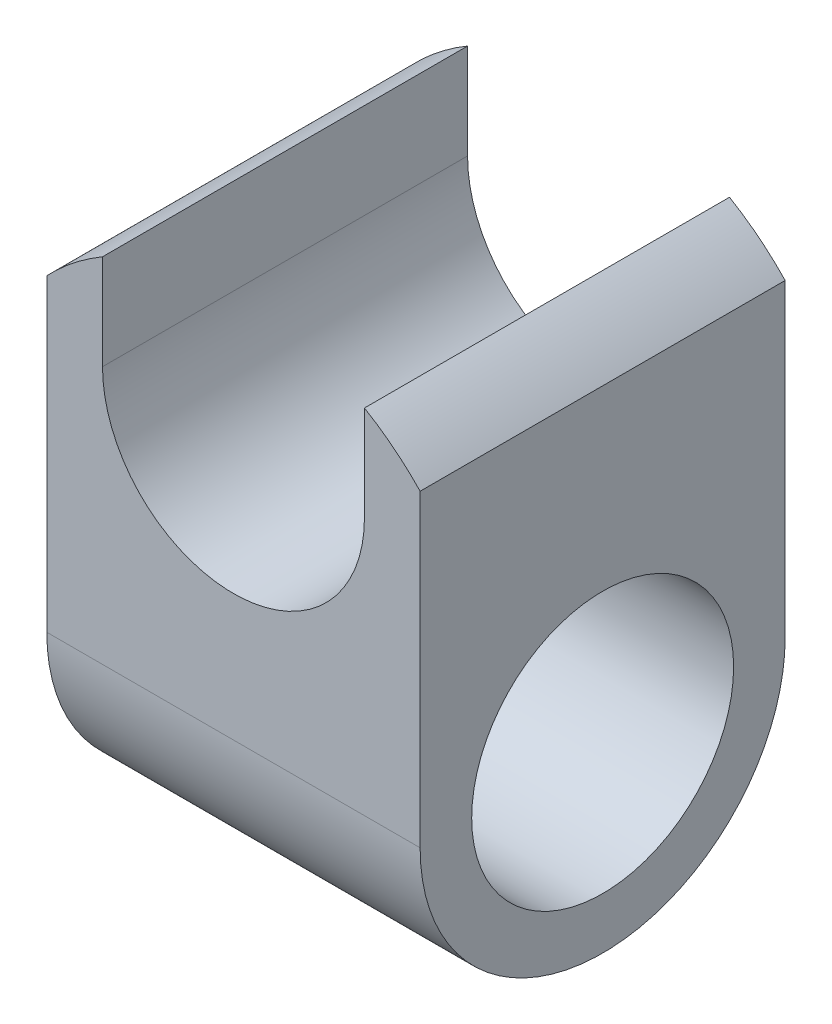
ISO-10303-21;
HEADER;
FILE_DESCRIPTION(('STEP AP214'),'2;1');
FILE_NAME('part.step','',(''),(''),'','','');
FILE_SCHEMA(('AUTOMOTIVE_DESIGN { 1 0 10303 214 1 1 1 1 }'));
ENDSEC;
DATA;
#1=APPLICATION_CONTEXT('core data for automotive mechanical design processes');
#2=APPLICATION_PROTOCOL_DEFINITION('international standard','automotive_design',2000,#1);
#3=PRODUCT_CONTEXT('',#1,'mechanical');
#4=PRODUCT('Part','Part','',(#3));
#5=PRODUCT_RELATED_PRODUCT_CATEGORY('part','',(#4));
#6=PRODUCT_DEFINITION_FORMATION('','',#4);
#7=PRODUCT_DEFINITION_CONTEXT('part definition',#1,'design');
#8=PRODUCT_DEFINITION('design','',#6,#7);
#9=PRODUCT_DEFINITION_SHAPE('','',#8);
#10=(LENGTH_UNIT() NAMED_UNIT(*) SI_UNIT(.MILLI.,.METRE.));
#11=(NAMED_UNIT(*) PLANE_ANGLE_UNIT() SI_UNIT($,.RADIAN.));
#12=(NAMED_UNIT(*) SI_UNIT($,.STERADIAN.) SOLID_ANGLE_UNIT());
#13=UNCERTAINTY_MEASURE_WITH_UNIT(LENGTH_MEASURE(1.E-05),#10,'distance_accuracy_value','');
#14=(GEOMETRIC_REPRESENTATION_CONTEXT(3) GLOBAL_UNCERTAINTY_ASSIGNED_CONTEXT((#13)) GLOBAL_UNIT_ASSIGNED_CONTEXT((#10,
#11,#12)) REPRESENTATION_CONTEXT('',''));
#15=CARTESIAN_POINT('',(0.,0.,0.));
#16=DIRECTION('',(0.,0.,1.));
#17=DIRECTION('',(1.,0.,0.));
#18=AXIS2_PLACEMENT_3D('',#15,#16,#17);
#19=CARTESIAN_POINT('',(0.,-18.65,8.85));
#20=DIRECTION('',(0.,0.,1.));
#21=DIRECTION('',(1.,0.,0.));
#22=AXIS2_PLACEMENT_3D('',#19,#20,#21);
#23=PLANE('',#22);
#24=CARTESIAN_POINT('',(0.,-6.15,8.85));
#25=DIRECTION('',(0.,0.,1.));
#26=DIRECTION('',(1.,0.,0.));
#27=AXIS2_PLACEMENT_3D('',#24,#25,#26);
#28=CIRCLE('',#27,12.5);
#29=CARTESIAN_POINT('',(-9.04999999999999,2.47249963757611,8.85));
#30=VERTEX_POINT('',#29);
#31=CARTESIAN_POINT('',(-6.35,4.61696336020514,8.85));
#32=VERTEX_POINT('',#31);
#33=EDGE_CURVE('E166',#30,#32,#28,.F.);
#34=ORIENTED_EDGE('',*,*,#33,.F.);
#35=DIRECTION('',(0.,-1.,0.));
#36=VECTOR('',#35,1.);
#37=CARTESIAN_POINT('',(-9.05,0.,8.85));
#38=LINE('',#37,#36);
#39=CARTESIAN_POINT('',(-9.05,-12.5,8.85));
#40=VERTEX_POINT('',#39);
#41=EDGE_CURVE('E163',#30,#40,#38,.T.);
#42=ORIENTED_EDGE('',*,*,#41,.T.);
#43=DIRECTION('',(-1.,0.,0.));
#44=VECTOR('',#43,1.);
#45=CARTESIAN_POINT('',(9.05,-12.5,8.85));
#46=LINE('',#45,#44);
#47=CARTESIAN_POINT('',(9.05,-12.5,8.85));
#48=VERTEX_POINT('',#47);
#49=EDGE_CURVE('E181',#48,#40,#46,.T.);
#50=ORIENTED_EDGE('',*,*,#49,.F.);
#51=DIRECTION('',(0.,1.,0.));
#52=VECTOR('',#51,1.);
#53=CARTESIAN_POINT('',(9.05,0.,8.85));
#54=LINE('',#53,#52);
#55=CARTESIAN_POINT('',(9.04999999999999,2.47249963757611,8.85));
#56=VERTEX_POINT('',#55);
#57=EDGE_CURVE('E188',#48,#56,#54,.T.);
#58=ORIENTED_EDGE('',*,*,#57,.T.);
#59=CARTESIAN_POINT('',(6.35,4.61696336020514,8.85));
#60=VERTEX_POINT('',#59);
#61=EDGE_CURVE('E164',#60,#56,#28,.F.);
#62=ORIENTED_EDGE('',*,*,#61,.F.);
#63=DIRECTION('',(0.,-1.,0.));
#64=VECTOR('',#63,1.);
#65=CARTESIAN_POINT('',(6.35,0.,8.85));
#66=LINE('',#65,#64);
#67=CARTESIAN_POINT('',(6.35,0.,8.85));
#68=VERTEX_POINT('',#67);
#69=EDGE_CURVE('E113',#60,#68,#66,.T.);
#70=ORIENTED_EDGE('',*,*,#69,.T.);
#71=CARTESIAN_POINT('',(0.,0.,8.85));
#72=DIRECTION('',(0.,0.,-1.));
#73=DIRECTION('',(1.,0.,0.));
#74=AXIS2_PLACEMENT_3D('',#71,#72,#73);
#75=CIRCLE('',#74,6.35);
#76=CARTESIAN_POINT('',(-6.35,0.,8.85));
#77=VERTEX_POINT('',#76);
#78=EDGE_CURVE('E120',#68,#77,#75,.T.);
#79=ORIENTED_EDGE('',*,*,#78,.T.);
#80=DIRECTION('',(0.,1.,0.));
#81=VECTOR('',#80,1.);
#82=CARTESIAN_POINT('',(-6.35,0.,8.85));
#83=LINE('',#82,#81);
#84=EDGE_CURVE('E123',#77,#32,#83,.T.);
#85=ORIENTED_EDGE('',*,*,#84,.T.);
#86=EDGE_LOOP('',(#34,#42,#50,#58,#62,#70,#79,#85));
#87=FACE_BOUND('',#86,.T.);
#88=ADVANCED_FACE('F32',(#87),#23,.T.);
#89=CARTESIAN_POINT('',(0.,-18.65,-8.85));
#90=DIRECTION('',(0.,0.,1.));
#91=DIRECTION('',(1.,0.,0.));
#92=AXIS2_PLACEMENT_3D('',#89,#90,#91);
#93=PLANE('',#92);
#94=DIRECTION('',(0.,-1.,0.));
#95=VECTOR('',#94,1.);
#96=CARTESIAN_POINT('',(-9.05,0.,-8.85));
#97=LINE('',#96,#95);
#98=CARTESIAN_POINT('',(-9.04999999999999,2.47249963757611,-8.85));
#99=VERTEX_POINT('',#98);
#100=CARTESIAN_POINT('',(-9.05,-12.5,-8.85));
#101=VERTEX_POINT('',#100);
#102=EDGE_CURVE('E125',#99,#101,#97,.T.);
#103=ORIENTED_EDGE('',*,*,#102,.F.);
#104=CARTESIAN_POINT('',(0.,-6.15,-8.85));
#105=DIRECTION('',(0.,0.,1.));
#106=DIRECTION('',(1.,0.,0.));
#107=AXIS2_PLACEMENT_3D('',#104,#105,#106);
#108=CIRCLE('',#107,12.5);
#109=CARTESIAN_POINT('',(-6.34999999999999,4.61696336020514,-8.85));
#110=VERTEX_POINT('',#109);
#111=EDGE_CURVE('E11',#99,#110,#108,.F.);
#112=ORIENTED_EDGE('',*,*,#111,.T.);
#113=DIRECTION('',(0.,1.,0.));
#114=VECTOR('',#113,1.);
#115=CARTESIAN_POINT('',(-6.35,0.,-8.85));
#116=LINE('',#115,#114);
#117=CARTESIAN_POINT('',(-6.35,0.,-8.85));
#118=VERTEX_POINT('',#117);
#119=EDGE_CURVE('E140',#118,#110,#116,.T.);
#120=ORIENTED_EDGE('',*,*,#119,.F.);
#121=CARTESIAN_POINT('',(0.,0.,-8.85));
#122=DIRECTION('',(0.,0.,-1.));
#123=DIRECTION('',(1.,0.,0.));
#124=AXIS2_PLACEMENT_3D('',#121,#122,#123);
#125=CIRCLE('',#124,6.35);
#126=CARTESIAN_POINT('',(6.35,0.,-8.85));
#127=VERTEX_POINT('',#126);
#128=EDGE_CURVE('E119',#127,#118,#125,.T.);
#129=ORIENTED_EDGE('',*,*,#128,.F.);
#130=DIRECTION('',(0.,-1.,0.));
#131=VECTOR('',#130,1.);
#132=CARTESIAN_POINT('',(6.35,0.,-8.85));
#133=LINE('',#132,#131);
#134=CARTESIAN_POINT('',(6.34999999999999,4.61696336020514,-8.85));
#135=VERTEX_POINT('',#134);
#136=EDGE_CURVE('E111',#135,#127,#133,.T.);
#137=ORIENTED_EDGE('',*,*,#136,.F.);
#138=CARTESIAN_POINT('',(9.04999999999999,2.47249963757611,-8.85));
#139=VERTEX_POINT('',#138);
#140=EDGE_CURVE('E46',#135,#139,#108,.F.);
#141=ORIENTED_EDGE('',*,*,#140,.T.);
#142=DIRECTION('',(0.,1.,0.));
#143=VECTOR('',#142,1.);
#144=CARTESIAN_POINT('',(9.05,0.,-8.85));
#145=LINE('',#144,#143);
#146=CARTESIAN_POINT('',(9.05,-12.5,-8.85));
#147=VERTEX_POINT('',#146);
#148=EDGE_CURVE('E121',#147,#139,#145,.T.);
#149=ORIENTED_EDGE('',*,*,#148,.F.);
#150=DIRECTION('',(-1.,0.,0.));
#151=VECTOR('',#150,1.);
#152=CARTESIAN_POINT('',(9.05,-12.5,-8.85));
#153=LINE('',#152,#151);
#154=EDGE_CURVE('E141',#147,#101,#153,.T.);
#155=ORIENTED_EDGE('',*,*,#154,.T.);
#156=EDGE_LOOP('',(#103,#112,#120,#129,#137,#141,#149,#155));
#157=FACE_BOUND('',#156,.T.);
#158=ADVANCED_FACE('F117',(#157),#93,.F.);
#159=CARTESIAN_POINT('',(-6.35,0.,8.85));
#160=DIRECTION('',(-1.,0.,0.));
#161=DIRECTION('',(0.,-1.,0.));
#162=AXIS2_PLACEMENT_3D('',#159,#160,#161);
#163=PLANE('',#162);
#164=ORIENTED_EDGE('',*,*,#119,.T.);
#165=DIRECTION('',(0.,0.,-1.));
#166=VECTOR('',#165,1.);
#167=CARTESIAN_POINT('',(-6.35,4.61696336020514,8.850025));
#168=LINE('',#167,#166);
#169=EDGE_CURVE('E61',#110,#32,#168,.F.);
#170=ORIENTED_EDGE('',*,*,#169,.T.);
#171=ORIENTED_EDGE('',*,*,#84,.F.);
#172=DIRECTION('',(0.,0.,-1.));
#173=VECTOR('',#172,1.);
#174=CARTESIAN_POINT('',(-6.35,0.,8.85));
#175=LINE('',#174,#173);
#176=EDGE_CURVE('E106',#77,#118,#175,.T.);
#177=ORIENTED_EDGE('',*,*,#176,.T.);
#178=EDGE_LOOP('',(#164,#170,#171,#177));
#179=FACE_BOUND('',#178,.T.);
#180=ADVANCED_FACE('F153',(#179),#163,.F.);
#181=CARTESIAN_POINT('',(-9.05,0.,8.85));
#182=DIRECTION('',(1.,0.,0.));
#183=DIRECTION('',(0.,1.,0.));
#184=AXIS2_PLACEMENT_3D('',#181,#182,#183);
#185=PLANE('',#184);
#186=ORIENTED_EDGE('',*,*,#41,.F.);
#187=DIRECTION('',(0.,0.,-1.));
#188=VECTOR('',#187,1.);
#189=CARTESIAN_POINT('',(-9.04999999999999,2.47249963757611,8.850025));
#190=LINE('',#189,#188);
#191=EDGE_CURVE('E158',#30,#99,#190,.T.);
#192=ORIENTED_EDGE('',*,*,#191,.T.);
#193=ORIENTED_EDGE('',*,*,#102,.T.);
#194=CARTESIAN_POINT('',(-9.05,-12.5,0.));
#195=DIRECTION('',(1.,0.,0.));
#196=DIRECTION('',(0.,0.,-1.));
#197=AXIS2_PLACEMENT_3D('',#194,#195,#196);
#198=CIRCLE('',#197,8.85);
#199=EDGE_CURVE('E174',#40,#101,#198,.T.);
#200=ORIENTED_EDGE('',*,*,#199,.F.);
#201=EDGE_LOOP('',(#186,#192,#193,#200));
#202=FACE_BOUND('',#201,.T.);
#203=CARTESIAN_POINT('',(-9.05,-12.5,0.));
#204=DIRECTION('',(1.,0.,0.));
#205=DIRECTION('',(0.,0.,-1.));
#206=AXIS2_PLACEMENT_3D('',#203,#204,#205);
#207=CIRCLE('',#206,6.35);
#208=CARTESIAN_POINT('',(-9.05,-12.5,-6.35));
#209=VERTEX_POINT('',#208);
#210=EDGE_CURVE('E175',#209,#209,#207,.T.);
#211=ORIENTED_EDGE('',*,*,#210,.T.);
#212=EDGE_LOOP('',(#211));
#213=FACE_BOUND('',#212,.T.);
#214=ADVANCED_FACE('F161',(#202,#213),#185,.F.);
#215=CARTESIAN_POINT('',(9.05,0.,8.85));
#216=DIRECTION('',(-1.,0.,0.));
#217=DIRECTION('',(0.,-1.,0.));
#218=AXIS2_PLACEMENT_3D('',#215,#216,#217);
#219=PLANE('',#218);
#220=ORIENTED_EDGE('',*,*,#148,.T.);
#221=DIRECTION('',(0.,0.,-1.));
#222=VECTOR('',#221,1.);
#223=CARTESIAN_POINT('',(9.04999999999999,2.47249963757611,8.850025));
#224=LINE('',#223,#222);
#225=EDGE_CURVE('E53',#139,#56,#224,.F.);
#226=ORIENTED_EDGE('',*,*,#225,.T.);
#227=ORIENTED_EDGE('',*,*,#57,.F.);
#228=CARTESIAN_POINT('',(9.05,-12.5,0.));
#229=DIRECTION('',(1.,0.,0.));
#230=DIRECTION('',(0.,0.,-1.));
#231=AXIS2_PLACEMENT_3D('',#228,#229,#230);
#232=CIRCLE('',#231,8.85);
#233=EDGE_CURVE('E178',#48,#147,#232,.T.);
#234=ORIENTED_EDGE('',*,*,#233,.T.);
#235=EDGE_LOOP('',(#220,#226,#227,#234));
#236=FACE_BOUND('',#235,.T.);
#237=CARTESIAN_POINT('',(9.05,-12.5,0.));
#238=DIRECTION('',(1.,0.,0.));
#239=DIRECTION('',(0.,0.,-1.));
#240=AXIS2_PLACEMENT_3D('',#237,#238,#239);
#241=CIRCLE('',#240,6.35);
#242=CARTESIAN_POINT('',(9.05,-12.5,-6.35));
#243=VERTEX_POINT('',#242);
#244=EDGE_CURVE('E171',#243,#243,#241,.T.);
#245=ORIENTED_EDGE('',*,*,#244,.F.);
#246=EDGE_LOOP('',(#245));
#247=FACE_BOUND('',#246,.T.);
#248=ADVANCED_FACE('F217',(#236,#247),#219,.F.);
#249=CARTESIAN_POINT('',(6.35,0.,8.85));
#250=DIRECTION('',(1.,0.,0.));
#251=DIRECTION('',(0.,1.,0.));
#252=AXIS2_PLACEMENT_3D('',#249,#250,#251);
#253=PLANE('',#252);
#254=ORIENTED_EDGE('',*,*,#69,.F.);
#255=DIRECTION('',(0.,0.,-1.));
#256=VECTOR('',#255,1.);
#257=CARTESIAN_POINT('',(6.35,4.61696336020514,8.850025));
#258=LINE('',#257,#256);
#259=EDGE_CURVE('E101',#60,#135,#258,.T.);
#260=ORIENTED_EDGE('',*,*,#259,.T.);
#261=ORIENTED_EDGE('',*,*,#136,.T.);
#262=DIRECTION('',(0.,0.,-1.));
#263=VECTOR('',#262,1.);
#264=CARTESIAN_POINT('',(6.35,0.,8.85));
#265=LINE('',#264,#263);
#266=EDGE_CURVE('E134',#68,#127,#265,.T.);
#267=ORIENTED_EDGE('',*,*,#266,.F.);
#268=EDGE_LOOP('',(#254,#260,#261,#267));
#269=FACE_BOUND('',#268,.T.);
#270=ADVANCED_FACE('F109',(#269),#253,.F.);
#271=CARTESIAN_POINT('',(9.05,-12.5,0.));
#272=DIRECTION('',(-1.,0.,0.));
#273=DIRECTION('',(0.,0.,1.));
#274=AXIS2_PLACEMENT_3D('',#271,#272,#273);
#275=CYLINDRICAL_SURFACE('',#274,8.85);
#276=ORIENTED_EDGE('',*,*,#199,.T.);
#277=ORIENTED_EDGE('',*,*,#154,.F.);
#278=ORIENTED_EDGE('',*,*,#233,.F.);
#279=ORIENTED_EDGE('',*,*,#49,.T.);
#280=EDGE_LOOP('',(#276,#277,#278,#279));
#281=FACE_BOUND('',#280,.T.);
#282=ADVANCED_FACE('F203',(#281),#275,.T.);
#283=CARTESIAN_POINT('',(9.05,-12.5,0.));
#284=DIRECTION('',(-1.,0.,0.));
#285=DIRECTION('',(0.,0.,1.));
#286=AXIS2_PLACEMENT_3D('',#283,#284,#285);
#287=CYLINDRICAL_SURFACE('',#286,6.35);
#288=ORIENTED_EDGE('',*,*,#244,.T.);
#289=EDGE_LOOP('',(#288));
#290=FACE_BOUND('',#289,.T.);
#291=ORIENTED_EDGE('',*,*,#210,.F.);
#292=EDGE_LOOP('',(#291));
#293=FACE_BOUND('',#292,.T.);
#294=CARTESIAN_POINT('',(-1.58113883008394,-6.15000000000006,0.));
#295=CARTESIAN_POINT('',(-1.58113705962312,-6.15000145753955,-0.0885903441609072));
#296=CARTESIAN_POINT('',(-1.57391270895007,-6.15187166087805,-0.1772075976748));
#297=CARTESIAN_POINT('',(-1.54514977340856,-6.1591579164813,-0.351970656496489));
#298=CARTESIAN_POINT('',(-1.52360414922115,-6.16457571247065,-0.438115224675328));
#299=CARTESIAN_POINT('',(-1.46665164817018,-6.17837248743741,-0.605455438981558));
#300=CARTESIAN_POINT('',(-1.43124396060179,-6.1867516396031,-0.686650795339671));
#301=CARTESIAN_POINT('',(-1.34739574278833,-6.20555086679359,-0.841735251896535));
#302=CARTESIAN_POINT('',(-1.29895722983049,-6.21597062584649,-0.915625480574568));
#303=CARTESIAN_POINT('',(-1.19053403537738,-6.23764063364857,-1.05367124463537));
#304=CARTESIAN_POINT('',(-1.13060490631841,-6.24888673225531,-1.1178710630842));
#305=CARTESIAN_POINT('',(-1.00067237515605,-6.2710037289594,-1.23518352921244));
#306=CARTESIAN_POINT('',(-0.930668960430561,-6.28187462658663,-1.28829616300048));
#307=CARTESIAN_POINT('',(-0.782802812340355,-6.30200452872659,-1.38189917354177));
#308=CARTESIAN_POINT('',(-0.704966689223011,-6.31126871784186,-1.42243049578716));
#309=CARTESIAN_POINT('',(-0.543444472498058,-6.32722286826786,-1.49014735636547));
#310=CARTESIAN_POINT('',(-0.459758107479884,-6.33391271005299,-1.51733227504798));
#311=CARTESIAN_POINT('',(-0.288479391159531,-6.34402642778419,-1.55786140376596));
#312=CARTESIAN_POINT('',(-0.200870062051489,-6.34743430397444,-1.57113783649173));
#313=CARTESIAN_POINT('',(-0.0245907727831609,-6.35056425532465,-1.58334477722183));
#314=CARTESIAN_POINT('',(0.0640792307774444,-6.35028617914509,-1.58227469618039));
#315=CARTESIAN_POINT('',(0.24047875298939,-6.34606151112496,-1.5657627609833));
#316=CARTESIAN_POINT('',(0.328200394278031,-6.34209470797341,-1.55024172643022));
#317=CARTESIAN_POINT('',(0.499697678904304,-6.33089171120356,-1.50503832432393));
#318=CARTESIAN_POINT('',(0.583473433997571,-6.32365561024007,-1.4753563581028));
#319=CARTESIAN_POINT('',(0.744493470028453,-6.30672458615921,-1.4025779624983));
#320=CARTESIAN_POINT('',(0.821751545052795,-6.29703503892916,-1.35951081582094));
#321=CARTESIAN_POINT('',(0.967713233994963,-6.27626269116443,-1.26099881237932));
#322=CARTESIAN_POINT('',(1.03641733908602,-6.26517997069995,-1.20555466681959));
#323=CARTESIAN_POINT('',(1.16291472177344,-6.24293493638723,-1.08416302815205));
#324=CARTESIAN_POINT('',(1.22077676661519,-6.23177362494861,-1.01828698995338));
#325=CARTESIAN_POINT('',(1.32460657968744,-6.21053418486657,-0.8775945630724));
#326=CARTESIAN_POINT('',(1.37057428945142,-6.20045606154771,-0.802778130446295));
#327=CARTESIAN_POINT('',(1.44944384031421,-6.18249583755114,-0.646393093174224));
#328=CARTESIAN_POINT('',(1.48235690954244,-6.17461185147317,-0.564830364231045));
#329=CARTESIAN_POINT('',(1.53443330513155,-6.16187779554366,-0.397201620744764));
#330=CARTESIAN_POINT('',(1.55359587693938,-6.15702789218807,-0.31113535935013));
#331=CARTESIAN_POINT('',(1.57784471688299,-6.15085900401263,-0.136374661621306));
#332=CARTESIAN_POINT('',(1.58284317407496,-6.1495620474563,-0.0476672606803523));
#333=CARTESIAN_POINT('',(1.57841222812395,-6.15070072571397,0.129364075303636));
#334=CARTESIAN_POINT('',(1.56898246618301,-6.1531364533516,0.217688000755707));
#335=CARTESIAN_POINT('',(1.53582320477844,-6.16149637624185,0.391787077881973));
#336=CARTESIAN_POINT('',(1.51204021070696,-6.16743361977559,0.477551428877534));
#337=CARTESIAN_POINT('',(1.45064643355126,-6.18216102380826,0.643717637420255));
#338=CARTESIAN_POINT('',(1.41303630089713,-6.19095105010971,0.724119746997689));
#339=CARTESIAN_POINT('',(1.32507259124495,-6.21036983967109,0.87690639911753));
#340=CARTESIAN_POINT('',(1.27477515522678,-6.22099043878185,0.949324294046927));
#341=CARTESIAN_POINT('',(1.16264867970742,-6.24291605411967,1.08447992204759));
#342=CARTESIAN_POINT('',(1.10082016364724,-6.25422103926405,1.14721809428337));
#343=CARTESIAN_POINT('',(0.967717041309267,-6.27618813593011,1.26095645447299));
#344=CARTESIAN_POINT('',(0.896499784620557,-6.28685362007384,1.31202313448126));
#345=CARTESIAN_POINT('',(0.746340026138232,-6.30644131650699,1.40158506922613));
#346=CARTESIAN_POINT('',(0.667397330347847,-6.31536348500239,1.4400800081631));
#347=CARTESIAN_POINT('',(0.50388672473893,-6.33050910900131,1.50364825061641));
#348=CARTESIAN_POINT('',(0.419309522268369,-6.33672797233607,1.52869873251643));
#349=CARTESIAN_POINT('',(0.247034206475407,-6.34577911558482,1.56474083689957));
#350=CARTESIAN_POINT('',(0.15933591979358,-6.3486112070786,1.57573167718868));
#351=CARTESIAN_POINT('',(-0.0173099221946479,-6.3505946316211,1.58345540502402));
#352=CARTESIAN_POINT('',(-0.106261903056547,-6.34972152708908,1.58009362916303));
#353=CARTESIAN_POINT('',(-0.28232682195005,-6.34433215181376,1.55896437436516));
#354=CARTESIAN_POINT('',(-0.369439752141265,-6.33981586554179,1.5411968340252));
#355=CARTESIAN_POINT('',(-0.539472773891624,-6.32761789373203,1.49159229569807));
#356=CARTESIAN_POINT('',(-0.622386575066805,-6.31993160828285,1.45973484729248));
#357=CARTESIAN_POINT('',(-0.7814885368887,-6.30223677405572,1.38267336801176));
#358=CARTESIAN_POINT('',(-0.857677189814572,-6.29222839544932,1.33747031508566));
#359=CARTESIAN_POINT('',(-1.0007099255423,-6.27106724715727,1.23515187602424));
#360=CARTESIAN_POINT('',(-1.0676068261188,-6.2599216281722,1.17810884295066));
#361=CARTESIAN_POINT('',(-1.19072879654862,-6.23767494974082,1.05346205604026));
#362=CARTESIAN_POINT('',(-1.24695308778131,-6.22657389360339,0.985857532344872));
#363=CARTESIAN_POINT('',(-1.34702832403183,-6.20569301175098,0.842279497021076));
#364=CARTESIAN_POINT('',(-1.39092842261606,-6.19590802088486,0.766340961544403));
#365=CARTESIAN_POINT('',(-1.46557625498102,-6.17867807526409,0.608040271774866));
#366=CARTESIAN_POINT('',(-1.49632993967108,-6.17123206214386,0.525681043903742));
#367=CARTESIAN_POINT('',(-1.54040131139334,-6.1603647041982,0.369707500429746));
#368=CARTESIAN_POINT('',(-1.55565717339422,-6.15650398300026,0.296663641142721));
#369=CARTESIAN_POINT('',(-1.57602680911708,-6.15132098471737,0.149086232637293));
#370=CARTESIAN_POINT('',(-1.58114032000406,-6.14999877341691,0.0745526448637228));
#371=CARTESIAN_POINT('',(-1.58113883008394,-6.15000000000006,0.));
#372=B_SPLINE_CURVE_WITH_KNOTS('',3,(#294,#295,#296,#297,#298,#299,#300,#301,#302,#303,#304,
#305,#306,#307,#308,#309,#310,#311,#312,#313,#314,#315,#316,#317,#318,#319,#320,#321,#322,#323,
#324,#325,#326,#327,#328,#329,#330,#331,#332,#333,#334,#335,#336,#337,#338,#339,#340,#341,#342,
#343,#344,#345,#346,#347,#348,#349,#350,#351,#352,#353,#354,#355,#356,#357,#358,#359,#360,#361,
#362,#363,#364,#365,#366,#367,#368,#369,#370,#371),.UNSPECIFIED.,.T.,.F.,(4,2,2,2,2,2,2,2,2,2,2,
2,2,2,2,2,2,2,2,2,2,2,2,2,2,2,2,2,2,2,2,2,2,2,2,2,2,2,4),(0.,0.265505508190903,
0.531141616596382,0.796793262706995,1.06240380723115,1.32676121459589,1.59111895317753,
1.85460710206959,2.11810748310324,2.38288603556851,2.64767545946699,2.91392432329526,
3.18016564186673,3.44582855720574,3.7114762110051,3.97537726662588,4.23927961942553,
4.50295449842199,4.76664384536549,5.03196440487552,5.29729156242928,5.56361375645964,
5.82992342426781,6.09507474038952,6.36021402317982,6.62380291813931,6.88739843389037,
7.15143999222214,7.41549623960129,7.68129676444256,7.94709842223727,8.21328714326178,
8.47945636315263,8.7440445619078,9.00865205629295,9.2721886955279,9.53560591454406,
9.75903460885335,9.98246909315298),.UNSPECIFIED.);
#373=CARTESIAN_POINT('',(-1.58113883008394,-6.15000000000006,0.));
#374=VERTEX_POINT('',#373);
#375=EDGE_CURVE('E37',#374,#374,#372,.T.);
#376=ORIENTED_EDGE('',*,*,#375,.F.);
#377=EDGE_LOOP('',(#376));
#378=FACE_BOUND('',#377,.T.);
#379=ADVANCED_FACE('F196',(#290,#293,#378),#287,.F.);
#380=CARTESIAN_POINT('',(0.,0.,8.85));
#381=DIRECTION('',(0.,0.,-1.));
#382=DIRECTION('',(-1.,0.,0.));
#383=AXIS2_PLACEMENT_3D('',#380,#381,#382);
#384=CYLINDRICAL_SURFACE('',#383,6.35);
#385=ORIENTED_EDGE('',*,*,#375,.T.);
#386=EDGE_LOOP('',(#385));
#387=FACE_BOUND('',#386,.T.);
#388=ORIENTED_EDGE('',*,*,#128,.T.);
#389=ORIENTED_EDGE('',*,*,#176,.F.);
#390=ORIENTED_EDGE('',*,*,#78,.F.);
#391=ORIENTED_EDGE('',*,*,#266,.T.);
#392=EDGE_LOOP('',(#388,#389,#390,#391));
#393=FACE_BOUND('',#392,.T.);
#394=ADVANCED_FACE('F34',(#387,#393),#384,.F.);
#395=CARTESIAN_POINT('',(0.,-6.15,8.850025));
#396=DIRECTION('',(0.,0.,-1.));
#397=DIRECTION('',(-1.,0.,0.));
#398=AXIS2_PLACEMENT_3D('',#395,#396,#397);
#399=CYLINDRICAL_SURFACE('',#398,12.5);
#400=ORIENTED_EDGE('',*,*,#61,.T.);
#401=ORIENTED_EDGE('',*,*,#225,.F.);
#402=ORIENTED_EDGE('',*,*,#140,.F.);
#403=ORIENTED_EDGE('',*,*,#259,.F.);
#404=EDGE_LOOP('',(#400,#401,#402,#403));
#405=FACE_BOUND('',#404,.T.);
#406=ADVANCED_FACE('F100',(#405),#399,.T.);
#407=ORIENTED_EDGE('',*,*,#33,.T.);
#408=ORIENTED_EDGE('',*,*,#169,.F.);
#409=ORIENTED_EDGE('',*,*,#111,.F.);
#410=ORIENTED_EDGE('',*,*,#191,.F.);
#411=EDGE_LOOP('',(#407,#408,#409,#410));
#412=FACE_BOUND('',#411,.T.);
#413=ADVANCED_FACE('F157',(#412),#399,.T.);
#414=CLOSED_SHELL('',(#88,#158,#180,#214,#248,#270,#282,#379,#394,#406,#413));
#415=MANIFOLD_SOLID_BREP('B2',#414);
#416=ADVANCED_BREP_SHAPE_REPRESENTATION('',(#18,#415),#14);
#417=SHAPE_DEFINITION_REPRESENTATION(#9,#416);
ENDSEC;
END-ISO-10303-21;
